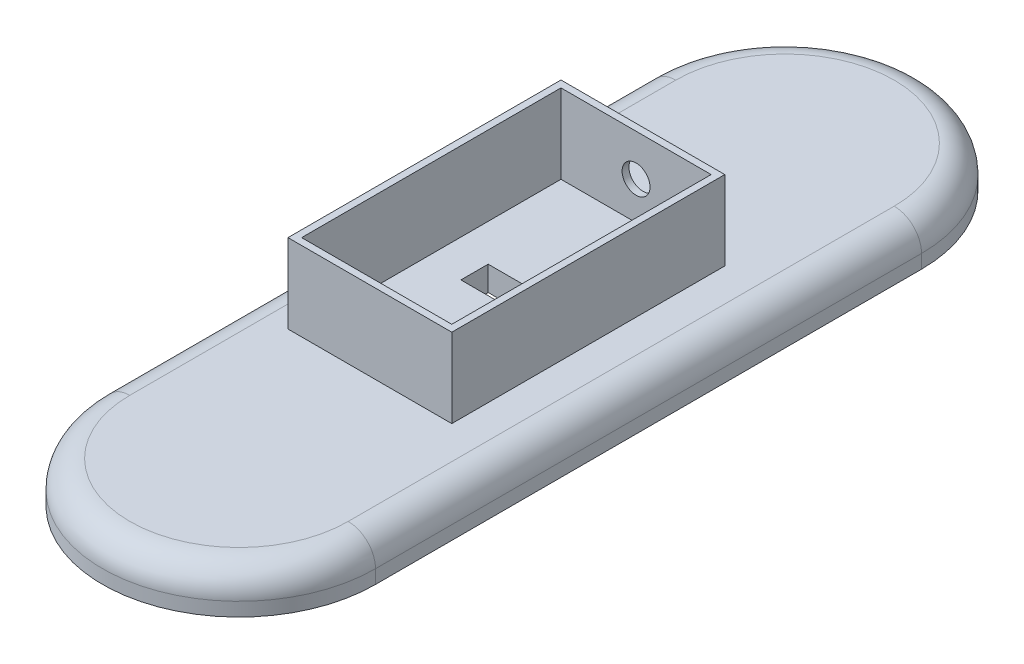
ISO-10303-21;
HEADER;
FILE_DESCRIPTION(('STEP AP214'),'2;1');
FILE_NAME('part.step','',(''),(''),'','','');
FILE_SCHEMA(('AUTOMOTIVE_DESIGN { 1 0 10303 214 1 1 1 1 }'));
ENDSEC;
DATA;
#1=APPLICATION_CONTEXT('core data for automotive mechanical design processes');
#2=APPLICATION_PROTOCOL_DEFINITION('international standard','automotive_design',2000,#1);
#3=PRODUCT_CONTEXT('',#1,'mechanical');
#4=PRODUCT('Part','Part','',(#3));
#5=PRODUCT_RELATED_PRODUCT_CATEGORY('part','',(#4));
#6=PRODUCT_DEFINITION_FORMATION('','',#4);
#7=PRODUCT_DEFINITION_CONTEXT('part definition',#1,'design');
#8=PRODUCT_DEFINITION('design','',#6,#7);
#9=PRODUCT_DEFINITION_SHAPE('','',#8);
#10=(LENGTH_UNIT() NAMED_UNIT(*) SI_UNIT(.MILLI.,.METRE.));
#11=(NAMED_UNIT(*) PLANE_ANGLE_UNIT() SI_UNIT($,.RADIAN.));
#12=(NAMED_UNIT(*) SI_UNIT($,.STERADIAN.) SOLID_ANGLE_UNIT());
#13=UNCERTAINTY_MEASURE_WITH_UNIT(LENGTH_MEASURE(1.E-05),#10,'distance_accuracy_value','');
#14=(GEOMETRIC_REPRESENTATION_CONTEXT(3) GLOBAL_UNCERTAINTY_ASSIGNED_CONTEXT((#13)) GLOBAL_UNIT_ASSIGNED_CONTEXT((#10,
#11,#12)) REPRESENTATION_CONTEXT('',''));
#15=CARTESIAN_POINT('',(0.,0.,0.));
#16=DIRECTION('',(0.,0.,1.));
#17=DIRECTION('',(1.,0.,0.));
#18=AXIS2_PLACEMENT_3D('',#15,#16,#17);
#19=CARTESIAN_POINT('',(-0.858369098712425,15.,-46.3059670043537));
#20=DIRECTION('',(0.,1.,0.));
#21=DIRECTION('',(0.,0.,1.));
#22=AXIS2_PLACEMENT_3D('',#19,#20,#21);
#23=PLANE('',#22);
#24=DIRECTION('',(-1.,0.,0.));
#25=VECTOR('',#24,1.);
#26=CARTESIAN_POINT('',(-0.858369098712425,15.,101.194032995646));
#27=LINE('',#26,#25);
#28=CARTESIAN_POINT('',(24.5844527959826,15.,101.194032995646));
#29=VERTEX_POINT('',#28);
#30=CARTESIAN_POINT('',(-30.4155472040174,15.,101.194032995646));
#31=VERTEX_POINT('',#30);
#32=EDGE_CURVE('E410',#29,#31,#27,.T.);
#33=ORIENTED_EDGE('',*,*,#32,.F.);
#34=DIRECTION('',(0.,0.,-1.));
#35=VECTOR('',#34,1.);
#36=CARTESIAN_POINT('',(24.5844527959826,15.,-46.3059670043537));
#37=LINE('',#36,#35);
#38=CARTESIAN_POINT('',(24.5844527959826,15.,6.19403299564631));
#39=VERTEX_POINT('',#38);
#40=EDGE_CURVE('E408',#29,#39,#37,.T.);
#41=ORIENTED_EDGE('',*,*,#40,.T.);
#42=DIRECTION('',(-1.,0.,0.));
#43=VECTOR('',#42,1.);
#44=CARTESIAN_POINT('',(-0.858369098712418,15.,6.19403299564632));
#45=LINE('',#44,#43);
#46=CARTESIAN_POINT('',(-30.4155472040174,15.,6.19403299564632));
#47=VERTEX_POINT('',#46);
#48=EDGE_CURVE('E406',#39,#47,#45,.T.);
#49=ORIENTED_EDGE('',*,*,#48,.T.);
#50=DIRECTION('',(0.,0.,-1.));
#51=VECTOR('',#50,1.);
#52=CARTESIAN_POINT('',(-30.4155472040174,15.,-46.3059670043537));
#53=LINE('',#52,#51);
#54=EDGE_CURVE('E366',#31,#47,#53,.T.);
#55=ORIENTED_EDGE('',*,*,#54,.F.);
#56=EDGE_LOOP('',(#33,#41,#49,#55));
#57=FACE_BOUND('',#56,.T.);
#58=DIRECTION('',(-1.,0.,0.));
#59=VECTOR('',#58,1.);
#60=CARTESIAN_POINT('',(-0.858369098712425,15.,56.4516669689759));
#61=LINE('',#60,#59);
#62=CARTESIAN_POINT('',(8.17093112982884,15.,56.4516669689759));
#63=VERTEX_POINT('',#62);
#64=CARTESIAN_POINT('',(-16.8290688701712,15.,56.4516669689759));
#65=VERTEX_POINT('',#64);
#66=EDGE_CURVE('E292',#63,#65,#61,.T.);
#67=ORIENTED_EDGE('',*,*,#66,.T.);
#68=DIRECTION('',(0.,0.,-1.));
#69=VECTOR('',#68,1.);
#70=CARTESIAN_POINT('',(-16.8290688701712,15.,-46.3059670043537));
#71=LINE('',#70,#69);
#72=CARTESIAN_POINT('',(-16.8290688701712,15.,46.4516669689759));
#73=VERTEX_POINT('',#72);
#74=EDGE_CURVE('E312',#65,#73,#71,.T.);
#75=ORIENTED_EDGE('',*,*,#74,.T.);
#76=DIRECTION('',(-1.,0.,0.));
#77=VECTOR('',#76,1.);
#78=CARTESIAN_POINT('',(-0.858369098712399,15.,46.4516669689759));
#79=LINE('',#78,#77);
#80=CARTESIAN_POINT('',(8.17093112982884,15.,46.4516669689759));
#81=VERTEX_POINT('',#80);
#82=EDGE_CURVE('E310',#81,#73,#79,.T.);
#83=ORIENTED_EDGE('',*,*,#82,.F.);
#84=DIRECTION('',(0.,0.,-1.));
#85=VECTOR('',#84,1.);
#86=CARTESIAN_POINT('',(8.17093112982884,15.,-46.3059670043537));
#87=LINE('',#86,#85);
#88=EDGE_CURVE('E297',#63,#81,#87,.T.);
#89=ORIENTED_EDGE('',*,*,#88,.F.);
#90=EDGE_LOOP('',(#67,#75,#83,#89));
#91=FACE_BOUND('',#90,.T.);
#92=ADVANCED_FACE('F98',(#57,#91),#23,.T.);
#93=CARTESIAN_POINT('',(0.,6.00000000000003,0.));
#94=DIRECTION('',(0.,1.,0.));
#95=DIRECTION('',(0.,0.,1.));
#96=AXIS2_PLACEMENT_3D('',#93,#94,#95);
#97=PLANE('',#96);
#98=DIRECTION('',(0.,0.,-1.));
#99=VECTOR('',#98,1.);
#100=CARTESIAN_POINT('',(24.5844527959826,6.00000000000003,0.));
#101=LINE('',#100,#99);
#102=CARTESIAN_POINT('',(24.5844527959826,6.00000000000003,101.194032995646));
#103=VERTEX_POINT('',#102);
#104=CARTESIAN_POINT('',(24.5844527959826,6.00000000000003,6.19403299564632));
#105=VERTEX_POINT('',#104);
#106=EDGE_CURVE('E504',#103,#105,#101,.T.);
#107=ORIENTED_EDGE('',*,*,#106,.F.);
#108=DIRECTION('',(-1.,0.,0.));
#109=VECTOR('',#108,1.);
#110=CARTESIAN_POINT('',(0.,6.00000000000003,101.194032995646));
#111=LINE('',#110,#109);
#112=CARTESIAN_POINT('',(-30.4155472040174,6.00000000000003,101.194032995646));
#113=VERTEX_POINT('',#112);
#114=EDGE_CURVE('E506',#103,#113,#111,.T.);
#115=ORIENTED_EDGE('',*,*,#114,.T.);
#116=DIRECTION('',(0.,0.,-1.));
#117=VECTOR('',#116,1.);
#118=CARTESIAN_POINT('',(-30.4155472040174,6.00000000000003,0.));
#119=LINE('',#118,#117);
#120=CARTESIAN_POINT('',(-30.4155472040174,6.00000000000003,6.19403299564632));
#121=VERTEX_POINT('',#120);
#122=EDGE_CURVE('E498',#113,#121,#119,.T.);
#123=ORIENTED_EDGE('',*,*,#122,.T.);
#124=DIRECTION('',(-1.,0.,0.));
#125=VECTOR('',#124,1.);
#126=CARTESIAN_POINT('',(0.,6.00000000000003,6.19403299564632));
#127=LINE('',#126,#125);
#128=EDGE_CURVE('E501',#105,#121,#127,.T.);
#129=ORIENTED_EDGE('',*,*,#128,.F.);
#130=EDGE_LOOP('',(#107,#115,#123,#129));
#131=FACE_BOUND('',#130,.T.);
#132=DIRECTION('',(0.,0.,-1.));
#133=VECTOR('',#132,1.);
#134=CARTESIAN_POINT('',(-16.8290688701712,6.00000000000003,0.));
#135=LINE('',#134,#133);
#136=CARTESIAN_POINT('',(-16.8290688701712,6.00000000000003,56.4516669689759));
#137=VERTEX_POINT('',#136);
#138=CARTESIAN_POINT('',(-16.8290688701712,6.00000000000003,46.4516669689759));
#139=VERTEX_POINT('',#138);
#140=EDGE_CURVE('E12',#137,#139,#135,.T.);
#141=ORIENTED_EDGE('',*,*,#140,.F.);
#142=DIRECTION('',(-1.,0.,0.));
#143=VECTOR('',#142,1.);
#144=CARTESIAN_POINT('',(0.,6.00000000000003,56.4516669689759));
#145=LINE('',#144,#143);
#146=CARTESIAN_POINT('',(8.17093112982884,6.00000000000003,56.4516669689759));
#147=VERTEX_POINT('',#146);
#148=EDGE_CURVE('E519',#147,#137,#145,.T.);
#149=ORIENTED_EDGE('',*,*,#148,.F.);
#150=DIRECTION('',(0.,0.,-1.));
#151=VECTOR('',#150,1.);
#152=CARTESIAN_POINT('',(8.17093112982884,6.00000000000003,0.));
#153=LINE('',#152,#151);
#154=CARTESIAN_POINT('',(8.17093112982884,6.00000000000003,46.4516669689759));
#155=VERTEX_POINT('',#154);
#156=EDGE_CURVE('E305',#147,#155,#153,.T.);
#157=ORIENTED_EDGE('',*,*,#156,.T.);
#158=DIRECTION('',(-1.,0.,0.));
#159=VECTOR('',#158,1.);
#160=CARTESIAN_POINT('',(0.,6.00000000000003,46.4516669689759));
#161=LINE('',#160,#159);
#162=EDGE_CURVE('E107',#155,#139,#161,.T.);
#163=ORIENTED_EDGE('',*,*,#162,.T.);
#164=EDGE_LOOP('',(#141,#149,#157,#163));
#165=FACE_BOUND('',#164,.T.);
#166=ADVANCED_FACE('F525',(#131,#165),#97,.F.);
#167=DIRECTION('',(0.,0.,1.));
#168=VECTOR('',#167,1.);
#169=CARTESIAN_POINT('',(-40.8583690987124,15.,-46.3059670043537));
#170=LINE('',#169,#168);
#171=CARTESIAN_POINT('',(-40.8583690987124,15.,-46.3059670043537));
#172=VERTEX_POINT('',#171);
#173=CARTESIAN_POINT('',(-40.8583690987124,15.,153.694032995646));
#174=VERTEX_POINT('',#173);
#175=EDGE_CURVE('E455',#172,#174,#170,.T.);
#176=ORIENTED_EDGE('',*,*,#175,.T.);
#177=CARTESIAN_POINT('',(-0.858369098712425,15.,153.694032995646));
#178=DIRECTION('',(0.,1.,0.));
#179=DIRECTION('',(0.,0.,1.));
#180=AXIS2_PLACEMENT_3D('',#177,#178,#179);
#181=CIRCLE('',#180,40.);
#182=CARTESIAN_POINT('',(39.1416309012876,15.,153.694032995646));
#183=VERTEX_POINT('',#182);
#184=EDGE_CURVE('E475',#174,#183,#181,.T.);
#185=ORIENTED_EDGE('',*,*,#184,.T.);
#186=DIRECTION('',(0.,0.,-1.));
#187=VECTOR('',#186,1.);
#188=CARTESIAN_POINT('',(39.1416309012876,15.,-46.3059670043537));
#189=LINE('',#188,#187);
#190=CARTESIAN_POINT('',(39.1416309012876,15.,-46.3059670043537));
#191=VERTEX_POINT('',#190);
#192=EDGE_CURVE('E472',#183,#191,#189,.T.);
#193=ORIENTED_EDGE('',*,*,#192,.T.);
#194=CARTESIAN_POINT('',(-0.858369098712425,15.,-46.3059670043537));
#195=DIRECTION('',(0.,1.,0.));
#196=DIRECTION('',(0.,0.,1.));
#197=AXIS2_PLACEMENT_3D('',#194,#195,#196);
#198=CIRCLE('',#197,40.);
#199=EDGE_CURVE('E469',#191,#172,#198,.T.);
#200=ORIENTED_EDGE('',*,*,#199,.T.);
#201=EDGE_LOOP('',(#176,#185,#193,#200));
#202=FACE_BOUND('',#201,.T.);
#203=DIRECTION('',(1.,0.,0.));
#204=VECTOR('',#203,1.);
#205=CARTESIAN_POINT('',(-0.858369098712425,15.,3.69403299564632));
#206=LINE('',#205,#204);
#207=CARTESIAN_POINT('',(-32.9155472040174,15.,3.69403299564632));
#208=VERTEX_POINT('',#207);
#209=CARTESIAN_POINT('',(27.0844527959826,15.,3.69403299564632));
#210=VERTEX_POINT('',#209);
#211=EDGE_CURVE('E396',#208,#210,#206,.T.);
#212=ORIENTED_EDGE('',*,*,#211,.T.);
#213=DIRECTION('',(0.,0.,1.));
#214=VECTOR('',#213,1.);
#215=CARTESIAN_POINT('',(27.0844527959826,15.,-46.3059670043537));
#216=LINE('',#215,#214);
#217=CARTESIAN_POINT('',(27.0844527959826,15.,103.694032995646));
#218=VERTEX_POINT('',#217);
#219=EDGE_CURVE('E403',#210,#218,#216,.T.);
#220=ORIENTED_EDGE('',*,*,#219,.T.);
#221=DIRECTION('',(1.,0.,0.));
#222=VECTOR('',#221,1.);
#223=CARTESIAN_POINT('',(-0.858369098712425,15.,103.694032995646));
#224=LINE('',#223,#222);
#225=CARTESIAN_POINT('',(-32.9155472040174,15.,103.694032995646));
#226=VERTEX_POINT('',#225);
#227=EDGE_CURVE('E401',#226,#218,#224,.T.);
#228=ORIENTED_EDGE('',*,*,#227,.F.);
#229=DIRECTION('',(0.,0.,1.));
#230=VECTOR('',#229,1.);
#231=CARTESIAN_POINT('',(-32.9155472040174,15.,-46.3059670043537));
#232=LINE('',#231,#230);
#233=EDGE_CURVE('E399',#208,#226,#232,.T.);
#234=ORIENTED_EDGE('',*,*,#233,.F.);
#235=EDGE_LOOP('',(#212,#220,#228,#234));
#236=FACE_BOUND('',#235,.T.);
#237=ADVANCED_FACE('F558',(#202,#236),#23,.T.);
#238=CARTESIAN_POINT('',(-0.858369098712425,6.00000000000003,-46.3059670043537));
#239=DIRECTION('',(0.,1.,0.));
#240=DIRECTION('',(0.,0.,1.));
#241=AXIS2_PLACEMENT_3D('',#238,#239,#240);
#242=CIRCLE('',#241,45.);
#243=CARTESIAN_POINT('',(44.1416309012876,6.00000000000003,-46.3059670043537));
#244=VERTEX_POINT('',#243);
#245=CARTESIAN_POINT('',(-45.8583690987124,6.00000000000003,-46.3059670043537));
#246=VERTEX_POINT('',#245);
#247=EDGE_CURVE('E414',#244,#246,#242,.T.);
#248=ORIENTED_EDGE('',*,*,#247,.F.);
#249=DIRECTION('',(0.,0.,-1.));
#250=VECTOR('',#249,1.);
#251=CARTESIAN_POINT('',(44.1416309012876,6.00000000000003,153.694032995646));
#252=LINE('',#251,#250);
#253=CARTESIAN_POINT('',(44.1416309012876,6.00000000000003,153.694032995646));
#254=VERTEX_POINT('',#253);
#255=EDGE_CURVE('E437',#254,#244,#252,.T.);
#256=ORIENTED_EDGE('',*,*,#255,.F.);
#257=CARTESIAN_POINT('',(-0.858369098712425,6.00000000000003,153.694032995646));
#258=DIRECTION('',(0.,1.,0.));
#259=DIRECTION('',(0.,0.,1.));
#260=AXIS2_PLACEMENT_3D('',#257,#258,#259);
#261=CIRCLE('',#260,45.);
#262=CARTESIAN_POINT('',(-45.8583690987124,6.00000000000003,153.694032995646));
#263=VERTEX_POINT('',#262);
#264=EDGE_CURVE('E427',#263,#254,#261,.T.);
#265=ORIENTED_EDGE('',*,*,#264,.F.);
#266=DIRECTION('',(0.,0.,-1.));
#267=VECTOR('',#266,1.);
#268=CARTESIAN_POINT('',(-45.8583690987124,6.00000000000003,153.694032995646));
#269=LINE('',#268,#267);
#270=EDGE_CURVE('E434',#263,#246,#269,.T.);
#271=ORIENTED_EDGE('',*,*,#270,.T.);
#272=EDGE_LOOP('',(#248,#256,#265,#271));
#273=FACE_BOUND('',#272,.T.);
#274=DIRECTION('',(0.,0.,1.));
#275=VECTOR('',#274,1.);
#276=CARTESIAN_POINT('',(27.0844527959826,6.00000000000003,0.));
#277=LINE('',#276,#275);
#278=CARTESIAN_POINT('',(27.0844527959826,6.00000000000003,3.69403299564632));
#279=VERTEX_POINT('',#278);
#280=CARTESIAN_POINT('',(27.0844527959826,6.00000000000003,103.694032995646));
#281=VERTEX_POINT('',#280);
#282=EDGE_CURVE('E516',#279,#281,#277,.T.);
#283=ORIENTED_EDGE('',*,*,#282,.F.);
#284=DIRECTION('',(1.,0.,0.));
#285=VECTOR('',#284,1.);
#286=CARTESIAN_POINT('',(0.,6.00000000000003,3.69403299564632));
#287=LINE('',#286,#285);
#288=CARTESIAN_POINT('',(-32.9155472040174,6.00000000000003,3.69403299564632));
#289=VERTEX_POINT('',#288);
#290=EDGE_CURVE('E509',#289,#279,#287,.T.);
#291=ORIENTED_EDGE('',*,*,#290,.F.);
#292=DIRECTION('',(0.,0.,1.));
#293=VECTOR('',#292,1.);
#294=CARTESIAN_POINT('',(-32.9155472040174,6.00000000000003,0.));
#295=LINE('',#294,#293);
#296=CARTESIAN_POINT('',(-32.9155472040174,6.00000000000003,103.694032995646));
#297=VERTEX_POINT('',#296);
#298=EDGE_CURVE('E512',#289,#297,#295,.T.);
#299=ORIENTED_EDGE('',*,*,#298,.T.);
#300=DIRECTION('',(1.,0.,0.));
#301=VECTOR('',#300,1.);
#302=CARTESIAN_POINT('',(0.,6.00000000000003,103.694032995646));
#303=LINE('',#302,#301);
#304=EDGE_CURVE('E514',#297,#281,#303,.T.);
#305=ORIENTED_EDGE('',*,*,#304,.T.);
#306=EDGE_LOOP('',(#283,#291,#299,#305));
#307=FACE_BOUND('',#306,.T.);
#308=ADVANCED_FACE('F597',(#273,#307),#97,.F.);
#309=CARTESIAN_POINT('',(-40.8583690987124,5.00000000000001,-46.3059670043537));
#310=DIRECTION('',(0.,0.,-1.));
#311=DIRECTION('',(-1.,0.,0.));
#312=AXIS2_PLACEMENT_3D('',#309,#310,#311);
#313=CYLINDRICAL_SURFACE('',#312,10.);
#314=CARTESIAN_POINT('',(-40.8583690987124,5.,153.694032995646));
#315=DIRECTION('',(0.,0.,1.));
#316=DIRECTION('',(1.,0.,0.));
#317=AXIS2_PLACEMENT_3D('',#314,#315,#316);
#318=CIRCLE('',#317,10.);
#319=CARTESIAN_POINT('',(-50.8583690987124,5.,153.694032995646));
#320=VERTEX_POINT('',#319);
#321=EDGE_CURVE('E496',#174,#320,#318,.T.);
#322=ORIENTED_EDGE('',*,*,#321,.F.);
#323=ORIENTED_EDGE('',*,*,#175,.F.);
#324=CARTESIAN_POINT('',(-40.8583690987124,5.,-46.3059670043537));
#325=DIRECTION('',(0.,0.,1.));
#326=DIRECTION('',(1.,0.,0.));
#327=AXIS2_PLACEMENT_3D('',#324,#325,#326);
#328=CIRCLE('',#327,10.);
#329=CARTESIAN_POINT('',(-50.8583690987124,5.,-46.3059670043537));
#330=VERTEX_POINT('',#329);
#331=EDGE_CURVE('E494',#172,#330,#328,.T.);
#332=ORIENTED_EDGE('',*,*,#331,.T.);
#333=DIRECTION('',(0.,0.,1.));
#334=VECTOR('',#333,1.);
#335=CARTESIAN_POINT('',(-50.8583690987124,5.00000000000001,-46.3059670043537));
#336=LINE('',#335,#334);
#337=EDGE_CURVE('E487',#320,#330,#336,.F.);
#338=ORIENTED_EDGE('',*,*,#337,.F.);
#339=EDGE_LOOP('',(#322,#323,#332,#338));
#340=FACE_BOUND('',#339,.T.);
#341=ADVANCED_FACE('F100',(#340),#313,.T.);
#342=CARTESIAN_POINT('',(-0.858369098712425,5.00000000000001,-46.3059670043537));
#343=DIRECTION('',(0.,1.,0.));
#344=DIRECTION('',(0.,0.,1.));
#345=AXIS2_PLACEMENT_3D('',#342,#343,#344);
#346=TOROIDAL_SURFACE('',#345,40.,10.);
#347=ORIENTED_EDGE('',*,*,#331,.F.);
#348=ORIENTED_EDGE('',*,*,#199,.F.);
#349=CARTESIAN_POINT('',(39.1416309012876,5.,-46.3059670043537));
#350=DIRECTION('',(0.,0.,-1.));
#351=DIRECTION('',(-1.,0.,0.));
#352=AXIS2_PLACEMENT_3D('',#349,#350,#351);
#353=CIRCLE('',#352,10.);
#354=CARTESIAN_POINT('',(49.1416309012876,5.,-46.3059670043537));
#355=VERTEX_POINT('',#354);
#356=EDGE_CURVE('E492',#191,#355,#353,.T.);
#357=ORIENTED_EDGE('',*,*,#356,.T.);
#358=CARTESIAN_POINT('',(-0.858369098712425,5.00000000000001,-46.3059670043537));
#359=DIRECTION('',(0.,1.,0.));
#360=DIRECTION('',(0.,0.,1.));
#361=AXIS2_PLACEMENT_3D('',#358,#359,#360);
#362=CIRCLE('',#361,50.);
#363=EDGE_CURVE('E484',#330,#355,#362,.F.);
#364=ORIENTED_EDGE('',*,*,#363,.F.);
#365=EDGE_LOOP('',(#347,#348,#357,#364));
#366=FACE_BOUND('',#365,.T.);
#367=ADVANCED_FACE('F629',(#366),#346,.T.);
#368=CARTESIAN_POINT('',(39.1416309012876,5.00000000000001,-46.3059670043537));
#369=DIRECTION('',(0.,0.,-1.));
#370=DIRECTION('',(-1.,0.,0.));
#371=AXIS2_PLACEMENT_3D('',#368,#369,#370);
#372=CYLINDRICAL_SURFACE('',#371,10.);
#373=ORIENTED_EDGE('',*,*,#356,.F.);
#374=ORIENTED_EDGE('',*,*,#192,.F.);
#375=CARTESIAN_POINT('',(39.1416309012876,5.,153.694032995646));
#376=DIRECTION('',(0.,0.,-1.));
#377=DIRECTION('',(-1.,0.,0.));
#378=AXIS2_PLACEMENT_3D('',#375,#376,#377);
#379=CIRCLE('',#378,10.);
#380=CARTESIAN_POINT('',(49.1416309012876,5.,153.694032995646));
#381=VERTEX_POINT('',#380);
#382=EDGE_CURVE('E490',#183,#381,#379,.T.);
#383=ORIENTED_EDGE('',*,*,#382,.T.);
#384=DIRECTION('',(0.,0.,-1.));
#385=VECTOR('',#384,1.);
#386=CARTESIAN_POINT('',(49.1416309012876,5.00000000000001,-46.3059670043537));
#387=LINE('',#386,#385);
#388=EDGE_CURVE('E481',#355,#381,#387,.F.);
#389=ORIENTED_EDGE('',*,*,#388,.F.);
#390=EDGE_LOOP('',(#373,#374,#383,#389));
#391=FACE_BOUND('',#390,.T.);
#392=ADVANCED_FACE('F618',(#391),#372,.T.);
#393=CARTESIAN_POINT('',(-0.858369098712425,5.00000000000001,153.694032995646));
#394=DIRECTION('',(0.,1.,0.));
#395=DIRECTION('',(0.,0.,1.));
#396=AXIS2_PLACEMENT_3D('',#393,#394,#395);
#397=TOROIDAL_SURFACE('',#396,40.,10.);
#398=ORIENTED_EDGE('',*,*,#184,.F.);
#399=ORIENTED_EDGE('',*,*,#321,.T.);
#400=CARTESIAN_POINT('',(-0.858369098712425,5.00000000000001,153.694032995646));
#401=DIRECTION('',(0.,1.,0.));
#402=DIRECTION('',(0.,0.,1.));
#403=AXIS2_PLACEMENT_3D('',#400,#401,#402);
#404=CIRCLE('',#403,50.);
#405=EDGE_CURVE('E478',#381,#320,#404,.F.);
#406=ORIENTED_EDGE('',*,*,#405,.F.);
#407=ORIENTED_EDGE('',*,*,#382,.F.);
#408=EDGE_LOOP('',(#398,#399,#406,#407));
#409=FACE_BOUND('',#408,.T.);
#410=ADVANCED_FACE('F614',(#409),#397,.T.);
#411=CARTESIAN_POINT('',(-0.858369098712425,0.,-46.3059670043537));
#412=DIRECTION('',(0.,1.,0.));
#413=DIRECTION('',(0.,0.,1.));
#414=AXIS2_PLACEMENT_3D('',#411,#412,#413);
#415=PLANE('',#414);
#416=CARTESIAN_POINT('',(-0.858369098712425,0.,-46.3059670043537));
#417=DIRECTION('',(0.,1.,0.));
#418=DIRECTION('',(0.,0.,1.));
#419=AXIS2_PLACEMENT_3D('',#416,#417,#418);
#420=CIRCLE('',#419,45.);
#421=CARTESIAN_POINT('',(44.1416309012876,0.,-46.3059670043537));
#422=VERTEX_POINT('',#421);
#423=CARTESIAN_POINT('',(-45.8583690987124,0.,-46.3059670043537));
#424=VERTEX_POINT('',#423);
#425=EDGE_CURVE('E418',#422,#424,#420,.T.);
#426=ORIENTED_EDGE('',*,*,#425,.T.);
#427=DIRECTION('',(0.,0.,-1.));
#428=VECTOR('',#427,1.);
#429=CARTESIAN_POINT('',(-45.8583690987124,0.,153.694032995646));
#430=LINE('',#429,#428);
#431=CARTESIAN_POINT('',(-45.8583690987124,0.,153.694032995646));
#432=VERTEX_POINT('',#431);
#433=EDGE_CURVE('E440',#432,#424,#430,.T.);
#434=ORIENTED_EDGE('',*,*,#433,.F.);
#435=CARTESIAN_POINT('',(-0.858369098712425,0.,153.694032995646));
#436=DIRECTION('',(0.,1.,0.));
#437=DIRECTION('',(0.,0.,1.));
#438=AXIS2_PLACEMENT_3D('',#435,#436,#437);
#439=CIRCLE('',#438,45.);
#440=CARTESIAN_POINT('',(44.1416309012876,0.,153.694032995646));
#441=VERTEX_POINT('',#440);
#442=EDGE_CURVE('E431',#432,#441,#439,.T.);
#443=ORIENTED_EDGE('',*,*,#442,.T.);
#444=DIRECTION('',(0.,0.,-1.));
#445=VECTOR('',#444,1.);
#446=CARTESIAN_POINT('',(44.1416309012876,0.,153.694032995646));
#447=LINE('',#446,#445);
#448=EDGE_CURVE('E413',#441,#422,#447,.T.);
#449=ORIENTED_EDGE('',*,*,#448,.T.);
#450=EDGE_LOOP('',(#426,#434,#443,#449));
#451=FACE_BOUND('',#450,.T.);
#452=CARTESIAN_POINT('',(-0.858369098712425,0.,-46.3059670043537));
#453=DIRECTION('',(0.,1.,0.));
#454=DIRECTION('',(0.,0.,1.));
#455=AXIS2_PLACEMENT_3D('',#452,#453,#454);
#456=CIRCLE('',#455,50.);
#457=CARTESIAN_POINT('',(49.1416309012876,0.,-46.3059670043537));
#458=VERTEX_POINT('',#457);
#459=CARTESIAN_POINT('',(-50.8583690987124,0.,-46.3059670043537));
#460=VERTEX_POINT('',#459);
#461=EDGE_CURVE('E447',#458,#460,#456,.T.);
#462=ORIENTED_EDGE('',*,*,#461,.F.);
#463=DIRECTION('',(0.,0.,1.));
#464=VECTOR('',#463,1.);
#465=CARTESIAN_POINT('',(49.1416309012876,0.,-46.3059670043537));
#466=LINE('',#465,#464);
#467=CARTESIAN_POINT('',(49.1416309012876,0.,153.694032995646));
#468=VERTEX_POINT('',#467);
#469=EDGE_CURVE('E456',#458,#468,#466,.T.);
#470=ORIENTED_EDGE('',*,*,#469,.T.);
#471=CARTESIAN_POINT('',(-0.858369098712425,0.,153.694032995646));
#472=DIRECTION('',(0.,1.,0.));
#473=DIRECTION('',(0.,0.,1.));
#474=AXIS2_PLACEMENT_3D('',#471,#472,#473);
#475=CIRCLE('',#474,50.);
#476=CARTESIAN_POINT('',(-50.8583690987124,0.,153.694032995646));
#477=VERTEX_POINT('',#476);
#478=EDGE_CURVE('E426',#477,#468,#475,.T.);
#479=ORIENTED_EDGE('',*,*,#478,.F.);
#480=DIRECTION('',(0.,0.,1.));
#481=VECTOR('',#480,1.);
#482=CARTESIAN_POINT('',(-50.8583690987124,0.,-46.3059670043537));
#483=LINE('',#482,#481);
#484=EDGE_CURVE('E459',#460,#477,#483,.T.);
#485=ORIENTED_EDGE('',*,*,#484,.F.);
#486=EDGE_LOOP('',(#462,#470,#479,#485));
#487=FACE_BOUND('',#486,.T.);
#488=ADVANCED_FACE('F639',(#451,#487),#415,.F.);
#489=CARTESIAN_POINT('',(-0.858369098712425,15.,-46.3059670043537));
#490=DIRECTION('',(0.,-1.,0.));
#491=DIRECTION('',(0.,0.,-1.));
#492=AXIS2_PLACEMENT_3D('',#489,#490,#491);
#493=CYLINDRICAL_SURFACE('',#492,50.);
#494=DIRECTION('',(0.,-1.,0.));
#495=VECTOR('',#494,1.);
#496=CARTESIAN_POINT('',(-50.8583690987124,15.,-46.3059670043537));
#497=LINE('',#496,#495);
#498=EDGE_CURVE('E453',#330,#460,#497,.T.);
#499=ORIENTED_EDGE('',*,*,#498,.F.);
#500=ORIENTED_EDGE('',*,*,#363,.T.);
#501=DIRECTION('',(0.,-1.,0.));
#502=VECTOR('',#501,1.);
#503=CARTESIAN_POINT('',(49.1416309012876,15.,-46.3059670043537));
#504=LINE('',#503,#502);
#505=EDGE_CURVE('E450',#355,#458,#504,.T.);
#506=ORIENTED_EDGE('',*,*,#505,.T.);
#507=ORIENTED_EDGE('',*,*,#461,.T.);
#508=EDGE_LOOP('',(#499,#500,#506,#507));
#509=FACE_BOUND('',#508,.T.);
#510=ADVANCED_FACE('F626',(#509),#493,.T.);
#511=CARTESIAN_POINT('',(-0.858369098712425,15.,153.694032995646));
#512=DIRECTION('',(0.,-1.,0.));
#513=DIRECTION('',(0.,0.,-1.));
#514=AXIS2_PLACEMENT_3D('',#511,#512,#513);
#515=CYLINDRICAL_SURFACE('',#514,50.);
#516=DIRECTION('',(0.,-1.,0.));
#517=VECTOR('',#516,1.);
#518=CARTESIAN_POINT('',(49.1416309012876,15.,153.694032995646));
#519=LINE('',#518,#517);
#520=EDGE_CURVE('E462',#381,#468,#519,.T.);
#521=ORIENTED_EDGE('',*,*,#520,.F.);
#522=ORIENTED_EDGE('',*,*,#405,.T.);
#523=DIRECTION('',(0.,-1.,0.));
#524=VECTOR('',#523,1.);
#525=CARTESIAN_POINT('',(-50.8583690987124,15.,153.694032995646));
#526=LINE('',#525,#524);
#527=EDGE_CURVE('E451',#320,#477,#526,.T.);
#528=ORIENTED_EDGE('',*,*,#527,.T.);
#529=ORIENTED_EDGE('',*,*,#478,.T.);
#530=EDGE_LOOP('',(#521,#522,#528,#529));
#531=FACE_BOUND('',#530,.T.);
#532=ADVANCED_FACE('F640',(#531),#515,.T.);
#533=CARTESIAN_POINT('',(49.1416309012876,15.,-46.3059670043537));
#534=DIRECTION('',(1.,0.,0.));
#535=DIRECTION('',(0.,0.,-1.));
#536=AXIS2_PLACEMENT_3D('',#533,#534,#535);
#537=PLANE('',#536);
#538=ORIENTED_EDGE('',*,*,#505,.F.);
#539=ORIENTED_EDGE('',*,*,#388,.T.);
#540=ORIENTED_EDGE('',*,*,#520,.T.);
#541=ORIENTED_EDGE('',*,*,#469,.F.);
#542=EDGE_LOOP('',(#538,#539,#540,#541));
#543=FACE_BOUND('',#542,.T.);
#544=ADVANCED_FACE('F621',(#543),#537,.T.);
#545=CARTESIAN_POINT('',(-50.8583690987124,15.,-46.3059670043537));
#546=DIRECTION('',(1.,0.,0.));
#547=DIRECTION('',(0.,0.,-1.));
#548=AXIS2_PLACEMENT_3D('',#545,#546,#547);
#549=PLANE('',#548);
#550=ORIENTED_EDGE('',*,*,#527,.F.);
#551=ORIENTED_EDGE('',*,*,#337,.T.);
#552=ORIENTED_EDGE('',*,*,#498,.T.);
#553=ORIENTED_EDGE('',*,*,#484,.T.);
#554=EDGE_LOOP('',(#550,#551,#552,#553));
#555=FACE_BOUND('',#554,.T.);
#556=ADVANCED_FACE('F647',(#555),#549,.F.);
#557=CARTESIAN_POINT('',(-0.858369098712425,6.00000000000003,-46.3059670043537));
#558=DIRECTION('',(0.,-1.,0.));
#559=DIRECTION('',(0.,0.,-1.));
#560=AXIS2_PLACEMENT_3D('',#557,#558,#559);
#561=CYLINDRICAL_SURFACE('',#560,45.);
#562=ORIENTED_EDGE('',*,*,#425,.F.);
#563=DIRECTION('',(0.,-1.,0.));
#564=VECTOR('',#563,1.);
#565=CARTESIAN_POINT('',(44.1416309012876,6.00000000000003,-46.3059670043537));
#566=LINE('',#565,#564);
#567=EDGE_CURVE('E423',#244,#422,#566,.T.);
#568=ORIENTED_EDGE('',*,*,#567,.F.);
#569=ORIENTED_EDGE('',*,*,#247,.T.);
#570=DIRECTION('',(0.,-1.,0.));
#571=VECTOR('',#570,1.);
#572=CARTESIAN_POINT('',(-45.8583690987124,6.00000000000003,-46.3059670043537));
#573=LINE('',#572,#571);
#574=EDGE_CURVE('E417',#246,#424,#573,.T.);
#575=ORIENTED_EDGE('',*,*,#574,.T.);
#576=EDGE_LOOP('',(#562,#568,#569,#575));
#577=FACE_BOUND('',#576,.T.);
#578=ADVANCED_FACE('F650',(#577),#561,.F.);
#579=CARTESIAN_POINT('',(-0.858369098712425,6.00000000000003,153.694032995646));
#580=DIRECTION('',(0.,-1.,0.));
#581=DIRECTION('',(0.,0.,-1.));
#582=AXIS2_PLACEMENT_3D('',#579,#580,#581);
#583=CYLINDRICAL_SURFACE('',#582,45.);
#584=DIRECTION('',(0.,-1.,0.));
#585=VECTOR('',#584,1.);
#586=CARTESIAN_POINT('',(44.1416309012876,6.00000000000003,153.694032995646));
#587=LINE('',#586,#585);
#588=EDGE_CURVE('E421',#254,#441,#587,.T.);
#589=ORIENTED_EDGE('',*,*,#588,.T.);
#590=ORIENTED_EDGE('',*,*,#442,.F.);
#591=DIRECTION('',(0.,-1.,0.));
#592=VECTOR('',#591,1.);
#593=CARTESIAN_POINT('',(-45.8583690987124,6.00000000000003,153.694032995646));
#594=LINE('',#593,#592);
#595=EDGE_CURVE('E430',#263,#432,#594,.T.);
#596=ORIENTED_EDGE('',*,*,#595,.F.);
#597=ORIENTED_EDGE('',*,*,#264,.T.);
#598=EDGE_LOOP('',(#589,#590,#596,#597));
#599=FACE_BOUND('',#598,.T.);
#600=ADVANCED_FACE('F644',(#599),#583,.F.);
#601=CARTESIAN_POINT('',(-45.8583690987124,6.00000000000003,153.694032995646));
#602=DIRECTION('',(-1.,0.,0.));
#603=DIRECTION('',(0.,0.,1.));
#604=AXIS2_PLACEMENT_3D('',#601,#602,#603);
#605=PLANE('',#604);
#606=ORIENTED_EDGE('',*,*,#433,.T.);
#607=ORIENTED_EDGE('',*,*,#574,.F.);
#608=ORIENTED_EDGE('',*,*,#270,.F.);
#609=ORIENTED_EDGE('',*,*,#595,.T.);
#610=EDGE_LOOP('',(#606,#607,#608,#609));
#611=FACE_BOUND('',#610,.T.);
#612=ADVANCED_FACE('F672',(#611),#605,.F.);
#613=CARTESIAN_POINT('',(44.1416309012876,6.00000000000003,153.694032995646));
#614=DIRECTION('',(-1.,0.,0.));
#615=DIRECTION('',(0.,0.,1.));
#616=AXIS2_PLACEMENT_3D('',#613,#614,#615);
#617=PLANE('',#616);
#618=ORIENTED_EDGE('',*,*,#448,.F.);
#619=ORIENTED_EDGE('',*,*,#588,.F.);
#620=ORIENTED_EDGE('',*,*,#255,.T.);
#621=ORIENTED_EDGE('',*,*,#567,.T.);
#622=EDGE_LOOP('',(#618,#619,#620,#621));
#623=FACE_BOUND('',#622,.T.);
#624=ADVANCED_FACE('F665',(#623),#617,.T.);
#625=CARTESIAN_POINT('',(0.,-0.5,3.69403299564632));
#626=DIRECTION('',(0.,0.,1.));
#627=DIRECTION('',(1.,0.,0.));
#628=AXIS2_PLACEMENT_3D('',#625,#626,#627);
#629=PLANE('',#628);
#630=DIRECTION('',(0.,1.,0.));
#631=VECTOR('',#630,1.);
#632=CARTESIAN_POINT('',(-32.9155472040174,-0.5,3.69403299564632));
#633=LINE('',#632,#631);
#634=CARTESIAN_POINT('',(-32.9155472040174,-0.5,3.69403299564632));
#635=VERTEX_POINT('',#634);
#636=EDGE_CURVE('E387',#635,#289,#633,.T.);
#637=ORIENTED_EDGE('',*,*,#636,.T.);
#638=ORIENTED_EDGE('',*,*,#290,.T.);
#639=DIRECTION('',(0.,1.,0.));
#640=VECTOR('',#639,1.);
#641=CARTESIAN_POINT('',(27.0844527959826,-0.5,3.69403299564632));
#642=LINE('',#641,#640);
#643=CARTESIAN_POINT('',(27.0844527959826,-0.5,3.69403299564632));
#644=VERTEX_POINT('',#643);
#645=EDGE_CURVE('E391',#644,#279,#642,.T.);
#646=ORIENTED_EDGE('',*,*,#645,.F.);
#647=DIRECTION('',(1.,0.,0.));
#648=VECTOR('',#647,1.);
#649=CARTESIAN_POINT('',(0.,-0.5,3.69403299564632));
#650=LINE('',#649,#648);
#651=EDGE_CURVE('E343',#635,#644,#650,.T.);
#652=ORIENTED_EDGE('',*,*,#651,.F.);
#653=EDGE_LOOP('',(#637,#638,#646,#652));
#654=FACE_BOUND('',#653,.T.);
#655=ADVANCED_FACE('F548',(#654),#629,.F.);
#656=CARTESIAN_POINT('',(-32.9155472040174,-0.5,0.));
#657=DIRECTION('',(-1.,0.,0.));
#658=DIRECTION('',(0.,0.,1.));
#659=AXIS2_PLACEMENT_3D('',#656,#657,#658);
#660=PLANE('',#659);
#661=ORIENTED_EDGE('',*,*,#298,.F.);
#662=ORIENTED_EDGE('',*,*,#636,.F.);
#663=DIRECTION('',(0.,0.,1.));
#664=VECTOR('',#663,1.);
#665=CARTESIAN_POINT('',(-32.9155472040174,-0.5,0.));
#666=LINE('',#665,#664);
#667=CARTESIAN_POINT('',(-32.9155472040174,-0.5,103.694032995646));
#668=VERTEX_POINT('',#667);
#669=EDGE_CURVE('E345',#635,#668,#666,.T.);
#670=ORIENTED_EDGE('',*,*,#669,.T.);
#671=DIRECTION('',(0.,1.,0.));
#672=VECTOR('',#671,1.);
#673=CARTESIAN_POINT('',(-32.9155472040174,-0.5,103.694032995646));
#674=LINE('',#673,#672);
#675=EDGE_CURVE('E383',#668,#297,#674,.T.);
#676=ORIENTED_EDGE('',*,*,#675,.T.);
#677=EDGE_LOOP('',(#661,#662,#670,#676));
#678=FACE_BOUND('',#677,.T.);
#679=ADVANCED_FACE('F687',(#678),#660,.T.);
#680=CARTESIAN_POINT('',(0.,-0.5,103.694032995646));
#681=DIRECTION('',(0.,0.,1.));
#682=DIRECTION('',(1.,0.,0.));
#683=AXIS2_PLACEMENT_3D('',#680,#681,#682);
#684=PLANE('',#683);
#685=ORIENTED_EDGE('',*,*,#304,.F.);
#686=ORIENTED_EDGE('',*,*,#675,.F.);
#687=DIRECTION('',(1.,0.,0.));
#688=VECTOR('',#687,1.);
#689=CARTESIAN_POINT('',(0.,-0.5,103.694032995646));
#690=LINE('',#689,#688);
#691=CARTESIAN_POINT('',(27.0844527959826,-0.5,103.694032995646));
#692=VERTEX_POINT('',#691);
#693=EDGE_CURVE('E348',#668,#692,#690,.T.);
#694=ORIENTED_EDGE('',*,*,#693,.T.);
#695=DIRECTION('',(0.,1.,0.));
#696=VECTOR('',#695,1.);
#697=CARTESIAN_POINT('',(27.0844527959826,-0.5,103.694032995646));
#698=LINE('',#697,#696);
#699=EDGE_CURVE('E379',#692,#281,#698,.T.);
#700=ORIENTED_EDGE('',*,*,#699,.T.);
#701=EDGE_LOOP('',(#685,#686,#694,#700));
#702=FACE_BOUND('',#701,.T.);
#703=ADVANCED_FACE('F692',(#702),#684,.T.);
#704=CARTESIAN_POINT('',(27.0844527959826,-0.5,0.));
#705=DIRECTION('',(-1.,0.,0.));
#706=DIRECTION('',(0.,0.,1.));
#707=AXIS2_PLACEMENT_3D('',#704,#705,#706);
#708=PLANE('',#707);
#709=ORIENTED_EDGE('',*,*,#645,.T.);
#710=ORIENTED_EDGE('',*,*,#282,.T.);
#711=ORIENTED_EDGE('',*,*,#699,.F.);
#712=DIRECTION('',(0.,0.,1.));
#713=VECTOR('',#712,1.);
#714=CARTESIAN_POINT('',(27.0844527959826,-0.5,0.));
#715=LINE('',#714,#713);
#716=EDGE_CURVE('E341',#644,#692,#715,.T.);
#717=ORIENTED_EDGE('',*,*,#716,.F.);
#718=EDGE_LOOP('',(#709,#710,#711,#717));
#719=FACE_BOUND('',#718,.T.);
#720=ADVANCED_FACE('F698',(#719),#708,.F.);
#721=CARTESIAN_POINT('',(0.,-0.5,0.));
#722=DIRECTION('',(0.,1.,0.));
#723=DIRECTION('',(0.,0.,1.));
#724=AXIS2_PLACEMENT_3D('',#721,#722,#723);
#725=PLANE('',#724);
#726=ORIENTED_EDGE('',*,*,#716,.T.);
#727=ORIENTED_EDGE('',*,*,#693,.F.);
#728=ORIENTED_EDGE('',*,*,#669,.F.);
#729=ORIENTED_EDGE('',*,*,#651,.T.);
#730=EDGE_LOOP('',(#726,#727,#728,#729));
#731=FACE_BOUND('',#730,.T.);
#732=DIRECTION('',(-1.,0.,0.));
#733=VECTOR('',#732,1.);
#734=CARTESIAN_POINT('',(0.,-0.5,101.194032995646));
#735=LINE('',#734,#733);
#736=CARTESIAN_POINT('',(24.5844527959826,-0.5,101.194032995646));
#737=VERTEX_POINT('',#736);
#738=CARTESIAN_POINT('',(-30.4155472040174,-0.5,101.194032995646));
#739=VERTEX_POINT('',#738);
#740=EDGE_CURVE('E351',#737,#739,#735,.T.);
#741=ORIENTED_EDGE('',*,*,#740,.F.);
#742=DIRECTION('',(0.,0.,-1.));
#743=VECTOR('',#742,1.);
#744=CARTESIAN_POINT('',(24.5844527959826,-0.5,0.));
#745=LINE('',#744,#743);
#746=CARTESIAN_POINT('',(24.5844527959826,-0.5,6.19403299564632));
#747=VERTEX_POINT('',#746);
#748=EDGE_CURVE('E359',#737,#747,#745,.T.);
#749=ORIENTED_EDGE('',*,*,#748,.T.);
#750=DIRECTION('',(-1.,0.,0.));
#751=VECTOR('',#750,1.);
#752=CARTESIAN_POINT('',(0.,-0.5,6.19403299564632));
#753=LINE('',#752,#751);
#754=CARTESIAN_POINT('',(-30.4155472040174,-0.5,6.19403299564632));
#755=VERTEX_POINT('',#754);
#756=EDGE_CURVE('E357',#747,#755,#753,.T.);
#757=ORIENTED_EDGE('',*,*,#756,.T.);
#758=DIRECTION('',(0.,0.,-1.));
#759=VECTOR('',#758,1.);
#760=CARTESIAN_POINT('',(-30.4155472040174,-0.5,0.));
#761=LINE('',#760,#759);
#762=EDGE_CURVE('E354',#739,#755,#761,.T.);
#763=ORIENTED_EDGE('',*,*,#762,.F.);
#764=EDGE_LOOP('',(#741,#749,#757,#763));
#765=FACE_BOUND('',#764,.T.);
#766=ADVANCED_FACE('F707',(#731,#765),#725,.F.);
#767=CARTESIAN_POINT('',(-30.4155472040174,-0.5,0.));
#768=DIRECTION('',(1.,0.,0.));
#769=DIRECTION('',(0.,0.,-1.));
#770=AXIS2_PLACEMENT_3D('',#767,#768,#769);
#771=PLANE('',#770);
#772=ORIENTED_EDGE('',*,*,#122,.F.);
#773=DIRECTION('',(0.,1.,0.));
#774=VECTOR('',#773,1.);
#775=CARTESIAN_POINT('',(-30.4155472040174,-0.5,101.194032995646));
#776=LINE('',#775,#774);
#777=EDGE_CURVE('E375',#739,#113,#776,.T.);
#778=ORIENTED_EDGE('',*,*,#777,.F.);
#779=ORIENTED_EDGE('',*,*,#762,.T.);
#780=DIRECTION('',(0.,1.,0.));
#781=VECTOR('',#780,1.);
#782=CARTESIAN_POINT('',(-30.4155472040174,-0.5,6.19403299564632));
#783=LINE('',#782,#781);
#784=EDGE_CURVE('E372',#755,#121,#783,.T.);
#785=ORIENTED_EDGE('',*,*,#784,.T.);
#786=EDGE_LOOP('',(#772,#778,#779,#785));
#787=FACE_BOUND('',#786,.T.);
#788=ADVANCED_FACE('F713',(#787),#771,.T.);
#789=CARTESIAN_POINT('',(0.,-0.5,6.19403299564632));
#790=DIRECTION('',(0.,0.,-1.));
#791=DIRECTION('',(-1.,0.,0.));
#792=AXIS2_PLACEMENT_3D('',#789,#790,#791);
#793=PLANE('',#792);
#794=DIRECTION('',(0.,1.,0.));
#795=VECTOR('',#794,1.);
#796=CARTESIAN_POINT('',(24.5844527959826,-0.5,6.19403299564632));
#797=LINE('',#796,#795);
#798=EDGE_CURVE('E368',#747,#105,#797,.T.);
#799=ORIENTED_EDGE('',*,*,#798,.T.);
#800=ORIENTED_EDGE('',*,*,#128,.T.);
#801=ORIENTED_EDGE('',*,*,#784,.F.);
#802=ORIENTED_EDGE('',*,*,#756,.F.);
#803=EDGE_LOOP('',(#799,#800,#801,#802));
#804=FACE_BOUND('',#803,.T.);
#805=ADVANCED_FACE('F705',(#804),#793,.F.);
#806=CARTESIAN_POINT('',(24.5844527959826,-0.5,0.));
#807=DIRECTION('',(1.,0.,0.));
#808=DIRECTION('',(0.,0.,-1.));
#809=AXIS2_PLACEMENT_3D('',#806,#807,#808);
#810=PLANE('',#809);
#811=DIRECTION('',(0.,1.,0.));
#812=VECTOR('',#811,1.);
#813=CARTESIAN_POINT('',(24.5844527959826,-0.5,101.194032995646));
#814=LINE('',#813,#812);
#815=EDGE_CURVE('E363',#737,#103,#814,.T.);
#816=ORIENTED_EDGE('',*,*,#815,.T.);
#817=ORIENTED_EDGE('',*,*,#106,.T.);
#818=ORIENTED_EDGE('',*,*,#798,.F.);
#819=ORIENTED_EDGE('',*,*,#748,.F.);
#820=EDGE_LOOP('',(#816,#817,#818,#819));
#821=FACE_BOUND('',#820,.T.);
#822=ADVANCED_FACE('F734',(#821),#810,.F.);
#823=CARTESIAN_POINT('',(0.,-0.5,101.194032995646));
#824=DIRECTION('',(0.,0.,-1.));
#825=DIRECTION('',(-1.,0.,0.));
#826=AXIS2_PLACEMENT_3D('',#823,#824,#825);
#827=PLANE('',#826);
#828=ORIENTED_EDGE('',*,*,#114,.F.);
#829=ORIENTED_EDGE('',*,*,#815,.F.);
#830=ORIENTED_EDGE('',*,*,#740,.T.);
#831=ORIENTED_EDGE('',*,*,#777,.T.);
#832=EDGE_LOOP('',(#828,#829,#830,#831));
#833=FACE_BOUND('',#832,.T.);
#834=ADVANCED_FACE('F731',(#833),#827,.T.);
#835=CARTESIAN_POINT('',(24.5844527959826,44.,101.194032995646));
#836=VERTEX_POINT('',#835);
#837=EDGE_CURVE('E367',#29,#836,#814,.T.);
#838=ORIENTED_EDGE('',*,*,#837,.F.);
#839=ORIENTED_EDGE('',*,*,#32,.T.);
#840=CARTESIAN_POINT('',(-30.4155472040174,44.,101.194032995646));
#841=VERTEX_POINT('',#840);
#842=EDGE_CURVE('E378',#31,#841,#776,.T.);
#843=ORIENTED_EDGE('',*,*,#842,.T.);
#844=DIRECTION('',(-1.,0.,0.));
#845=VECTOR('',#844,1.);
#846=CARTESIAN_POINT('',(0.,44.,101.194032995646));
#847=LINE('',#846,#845);
#848=EDGE_CURVE('E329',#836,#841,#847,.T.);
#849=ORIENTED_EDGE('',*,*,#848,.F.);
#850=EDGE_LOOP('',(#838,#839,#843,#849));
#851=FACE_BOUND('',#850,.T.);
#852=ADVANCED_FACE('F578',(#851),#827,.T.);
#853=ORIENTED_EDGE('',*,*,#40,.F.);
#854=ORIENTED_EDGE('',*,*,#837,.T.);
#855=DIRECTION('',(0.,0.,-1.));
#856=VECTOR('',#855,1.);
#857=CARTESIAN_POINT('',(24.5844527959826,44.,0.));
#858=LINE('',#857,#856);
#859=CARTESIAN_POINT('',(24.5844527959826,44.,6.19403299564632));
#860=VERTEX_POINT('',#859);
#861=EDGE_CURVE('E338',#836,#860,#858,.T.);
#862=ORIENTED_EDGE('',*,*,#861,.T.);
#863=EDGE_CURVE('E371',#39,#860,#797,.T.);
#864=ORIENTED_EDGE('',*,*,#863,.F.);
#865=EDGE_LOOP('',(#853,#854,#862,#864));
#866=FACE_BOUND('',#865,.T.);
#867=ADVANCED_FACE('F588',(#866),#810,.F.);
#868=CARTESIAN_POINT('',(-2.91554720401739,28.8132798573976,6.19403299564632));
#869=DIRECTION('',(0.,0.,-1.));
#870=DIRECTION('',(-1.,0.,0.));
#871=AXIS2_PLACEMENT_3D('',#868,#869,#870);
#872=CIRCLE('',#871,5.11880720627623);
#873=CARTESIAN_POINT('',(-8.03435441029362,28.8132798573976,6.19403299564632));
#874=VERTEX_POINT('',#873);
#875=EDGE_CURVE('E533',#874,#874,#872,.F.);
#876=ORIENTED_EDGE('',*,*,#875,.F.);
#877=EDGE_LOOP('',(#876));
#878=FACE_BOUND('',#877,.T.);
#879=ORIENTED_EDGE('',*,*,#48,.F.);
#880=ORIENTED_EDGE('',*,*,#863,.T.);
#881=DIRECTION('',(-1.,0.,0.));
#882=VECTOR('',#881,1.);
#883=CARTESIAN_POINT('',(0.,44.,6.19403299564632));
#884=LINE('',#883,#882);
#885=CARTESIAN_POINT('',(-30.4155472040174,44.,6.19403299564632));
#886=VERTEX_POINT('',#885);
#887=EDGE_CURVE('E335',#860,#886,#884,.T.);
#888=ORIENTED_EDGE('',*,*,#887,.T.);
#889=EDGE_CURVE('E374',#47,#886,#783,.T.);
#890=ORIENTED_EDGE('',*,*,#889,.F.);
#891=EDGE_LOOP('',(#879,#880,#888,#890));
#892=FACE_BOUND('',#891,.T.);
#893=ADVANCED_FACE('F584',(#878,#892),#793,.F.);
#894=ORIENTED_EDGE('',*,*,#219,.F.);
#895=CARTESIAN_POINT('',(27.0844527959826,44.,3.69403299564632));
#896=VERTEX_POINT('',#895);
#897=EDGE_CURVE('E362',#210,#896,#642,.T.);
#898=ORIENTED_EDGE('',*,*,#897,.T.);
#899=DIRECTION('',(0.,0.,1.));
#900=VECTOR('',#899,1.);
#901=CARTESIAN_POINT('',(27.0844527959826,44.,0.));
#902=LINE('',#901,#900);
#903=CARTESIAN_POINT('',(27.0844527959826,44.,103.694032995646));
#904=VERTEX_POINT('',#903);
#905=EDGE_CURVE('E317',#896,#904,#902,.T.);
#906=ORIENTED_EDGE('',*,*,#905,.T.);
#907=EDGE_CURVE('E382',#218,#904,#698,.T.);
#908=ORIENTED_EDGE('',*,*,#907,.F.);
#909=EDGE_LOOP('',(#894,#898,#906,#908));
#910=FACE_BOUND('',#909,.T.);
#911=ADVANCED_FACE('F564',(#910),#708,.F.);
#912=CARTESIAN_POINT('',(-32.9155472040174,44.,103.694032995646));
#913=VERTEX_POINT('',#912);
#914=EDGE_CURVE('E386',#226,#913,#674,.T.);
#915=ORIENTED_EDGE('',*,*,#914,.F.);
#916=ORIENTED_EDGE('',*,*,#227,.T.);
#917=ORIENTED_EDGE('',*,*,#907,.T.);
#918=DIRECTION('',(1.,0.,0.));
#919=VECTOR('',#918,1.);
#920=CARTESIAN_POINT('',(0.,44.,103.694032995646));
#921=LINE('',#920,#919);
#922=EDGE_CURVE('E326',#913,#904,#921,.T.);
#923=ORIENTED_EDGE('',*,*,#922,.F.);
#924=EDGE_LOOP('',(#915,#916,#917,#923));
#925=FACE_BOUND('',#924,.T.);
#926=ADVANCED_FACE('F561',(#925),#684,.T.);
#927=CARTESIAN_POINT('',(-32.9155472040174,44.,3.69403299564632));
#928=VERTEX_POINT('',#927);
#929=EDGE_CURVE('E390',#208,#928,#633,.T.);
#930=ORIENTED_EDGE('',*,*,#929,.F.);
#931=ORIENTED_EDGE('',*,*,#233,.T.);
#932=ORIENTED_EDGE('',*,*,#914,.T.);
#933=DIRECTION('',(0.,0.,1.));
#934=VECTOR('',#933,1.);
#935=CARTESIAN_POINT('',(-32.9155472040174,44.,0.));
#936=LINE('',#935,#934);
#937=EDGE_CURVE('E323',#928,#913,#936,.T.);
#938=ORIENTED_EDGE('',*,*,#937,.F.);
#939=EDGE_LOOP('',(#930,#931,#932,#938));
#940=FACE_BOUND('',#939,.T.);
#941=ADVANCED_FACE('F546',(#940),#660,.T.);
#942=CARTESIAN_POINT('',(-2.91554720401739,28.8132798573976,3.69403299564632));
#943=DIRECTION('',(0.,0.,1.));
#944=DIRECTION('',(1.,0.,0.));
#945=AXIS2_PLACEMENT_3D('',#942,#943,#944);
#946=CIRCLE('',#945,5.11880720627623);
#947=CARTESIAN_POINT('',(2.20326000225884,28.8132798573976,3.69403299564632));
#948=VERTEX_POINT('',#947);
#949=EDGE_CURVE('E102',#948,#948,#946,.F.);
#950=ORIENTED_EDGE('',*,*,#949,.F.);
#951=EDGE_LOOP('',(#950));
#952=FACE_BOUND('',#951,.T.);
#953=ORIENTED_EDGE('',*,*,#211,.F.);
#954=ORIENTED_EDGE('',*,*,#929,.T.);
#955=DIRECTION('',(1.,0.,0.));
#956=VECTOR('',#955,1.);
#957=CARTESIAN_POINT('',(0.,44.,3.69403299564632));
#958=LINE('',#957,#956);
#959=EDGE_CURVE('E320',#928,#896,#958,.T.);
#960=ORIENTED_EDGE('',*,*,#959,.T.);
#961=ORIENTED_EDGE('',*,*,#897,.F.);
#962=EDGE_LOOP('',(#953,#954,#960,#961));
#963=FACE_BOUND('',#962,.T.);
#964=ADVANCED_FACE('F542',(#952,#963),#629,.F.);
#965=ORIENTED_EDGE('',*,*,#842,.F.);
#966=ORIENTED_EDGE('',*,*,#54,.T.);
#967=ORIENTED_EDGE('',*,*,#889,.T.);
#968=DIRECTION('',(0.,0.,-1.));
#969=VECTOR('',#968,1.);
#970=CARTESIAN_POINT('',(-30.4155472040174,44.,0.));
#971=LINE('',#970,#969);
#972=EDGE_CURVE('E332',#841,#886,#971,.T.);
#973=ORIENTED_EDGE('',*,*,#972,.F.);
#974=EDGE_LOOP('',(#965,#966,#967,#973));
#975=FACE_BOUND('',#974,.T.);
#976=ADVANCED_FACE('F545',(#975),#771,.T.);
#977=CARTESIAN_POINT('',(0.,44.,0.));
#978=DIRECTION('',(0.,1.,0.));
#979=DIRECTION('',(0.,0.,1.));
#980=AXIS2_PLACEMENT_3D('',#977,#978,#979);
#981=PLANE('',#980);
#982=ORIENTED_EDGE('',*,*,#905,.F.);
#983=ORIENTED_EDGE('',*,*,#959,.F.);
#984=ORIENTED_EDGE('',*,*,#937,.T.);
#985=ORIENTED_EDGE('',*,*,#922,.T.);
#986=EDGE_LOOP('',(#982,#983,#984,#985));
#987=FACE_BOUND('',#986,.T.);
#988=ORIENTED_EDGE('',*,*,#848,.T.);
#989=ORIENTED_EDGE('',*,*,#972,.T.);
#990=ORIENTED_EDGE('',*,*,#887,.F.);
#991=ORIENTED_EDGE('',*,*,#861,.F.);
#992=EDGE_LOOP('',(#988,#989,#990,#991));
#993=FACE_BOUND('',#992,.T.);
#994=ADVANCED_FACE('F567',(#987,#993),#981,.T.);
#995=CARTESIAN_POINT('',(-16.8290688701712,-131.,0.));
#996=DIRECTION('',(1.,0.,0.));
#997=DIRECTION('',(0.,0.,-1.));
#998=AXIS2_PLACEMENT_3D('',#995,#996,#997);
#999=PLANE('',#998);
#1000=DIRECTION('',(0.,1.,0.));
#1001=VECTOR('',#1000,1.);
#1002=CARTESIAN_POINT('',(-16.8290688701712,-131.,56.4516669689759));
#1003=LINE('',#1002,#1001);
#1004=EDGE_CURVE('E114',#137,#65,#1003,.T.);
#1005=ORIENTED_EDGE('',*,*,#1004,.F.);
#1006=ORIENTED_EDGE('',*,*,#140,.T.);
#1007=DIRECTION('',(0.,1.,0.));
#1008=VECTOR('',#1007,1.);
#1009=CARTESIAN_POINT('',(-16.8290688701712,-131.,46.4516669689759));
#1010=LINE('',#1009,#1008);
#1011=EDGE_CURVE('E298',#139,#73,#1010,.T.);
#1012=ORIENTED_EDGE('',*,*,#1011,.T.);
#1013=ORIENTED_EDGE('',*,*,#74,.F.);
#1014=EDGE_LOOP('',(#1005,#1006,#1012,#1013));
#1015=FACE_BOUND('',#1014,.T.);
#1016=ADVANCED_FACE('F570',(#1015),#999,.T.);
#1017=CARTESIAN_POINT('',(0.,-131.,46.4516669689759));
#1018=DIRECTION('',(0.,0.,-1.));
#1019=DIRECTION('',(-1.,0.,0.));
#1020=AXIS2_PLACEMENT_3D('',#1017,#1018,#1019);
#1021=PLANE('',#1020);
#1022=ORIENTED_EDGE('',*,*,#82,.T.);
#1023=ORIENTED_EDGE('',*,*,#1011,.F.);
#1024=ORIENTED_EDGE('',*,*,#162,.F.);
#1025=DIRECTION('',(0.,1.,0.));
#1026=VECTOR('',#1025,1.);
#1027=CARTESIAN_POINT('',(8.17093112982884,-131.,46.4516669689759));
#1028=LINE('',#1027,#1026);
#1029=EDGE_CURVE('E307',#155,#81,#1028,.T.);
#1030=ORIENTED_EDGE('',*,*,#1029,.T.);
#1031=EDGE_LOOP('',(#1022,#1023,#1024,#1030));
#1032=FACE_BOUND('',#1031,.T.);
#1033=ADVANCED_FACE('F528',(#1032),#1021,.F.);
#1034=CARTESIAN_POINT('',(8.17093112982884,-131.,0.));
#1035=DIRECTION('',(1.,0.,0.));
#1036=DIRECTION('',(0.,0.,-1.));
#1037=AXIS2_PLACEMENT_3D('',#1034,#1035,#1036);
#1038=PLANE('',#1037);
#1039=ORIENTED_EDGE('',*,*,#88,.T.);
#1040=ORIENTED_EDGE('',*,*,#1029,.F.);
#1041=ORIENTED_EDGE('',*,*,#156,.F.);
#1042=DIRECTION('',(0.,1.,0.));
#1043=VECTOR('',#1042,1.);
#1044=CARTESIAN_POINT('',(8.17093112982884,-131.,56.4516669689759));
#1045=LINE('',#1044,#1043);
#1046=EDGE_CURVE('E119',#147,#63,#1045,.T.);
#1047=ORIENTED_EDGE('',*,*,#1046,.T.);
#1048=EDGE_LOOP('',(#1039,#1040,#1041,#1047));
#1049=FACE_BOUND('',#1048,.T.);
#1050=ADVANCED_FACE('F301',(#1049),#1038,.F.);
#1051=CARTESIAN_POINT('',(0.,-131.,56.4516669689759));
#1052=DIRECTION('',(0.,0.,-1.));
#1053=DIRECTION('',(-1.,0.,0.));
#1054=AXIS2_PLACEMENT_3D('',#1051,#1052,#1053);
#1055=PLANE('',#1054);
#1056=ORIENTED_EDGE('',*,*,#1046,.F.);
#1057=ORIENTED_EDGE('',*,*,#148,.T.);
#1058=ORIENTED_EDGE('',*,*,#1004,.T.);
#1059=ORIENTED_EDGE('',*,*,#66,.F.);
#1060=EDGE_LOOP('',(#1056,#1057,#1058,#1059));
#1061=FACE_BOUND('',#1060,.T.);
#1062=ADVANCED_FACE('F293',(#1061),#1055,.T.);
#1063=CARTESIAN_POINT('',(-2.91554720401739,28.8132798573976,13.));
#1064=DIRECTION('',(0.,0.,-1.));
#1065=DIRECTION('',(-1.,0.,0.));
#1066=AXIS2_PLACEMENT_3D('',#1063,#1064,#1065);
#1067=CYLINDRICAL_SURFACE('',#1066,5.11880720627623);
#1068=ORIENTED_EDGE('',*,*,#949,.T.);
#1069=EDGE_LOOP('',(#1068));
#1070=FACE_BOUND('',#1069,.T.);
#1071=ORIENTED_EDGE('',*,*,#875,.T.);
#1072=EDGE_LOOP('',(#1071));
#1073=FACE_BOUND('',#1072,.T.);
#1074=ADVANCED_FACE('F540',(#1070,#1073),#1067,.F.);
#1075=CLOSED_SHELL('',(#92,#166,#237,#308,#341,#367,#392,#410,#488,#510,#532,#544,#556,#578,
#600,#612,#624,#655,#679,#703,#720,#766,#788,#805,#822,#834,#852,#867,#893,#911,#926,#941,#964,
#976,#994,#1016,#1033,#1050,#1062,#1074));
#1076=MANIFOLD_SOLID_BREP('B2',#1075);
#1077=ADVANCED_BREP_SHAPE_REPRESENTATION('',(#18,#1076),#14);
#1078=SHAPE_DEFINITION_REPRESENTATION(#9,#1077);
ENDSEC;
END-ISO-10303-21;
